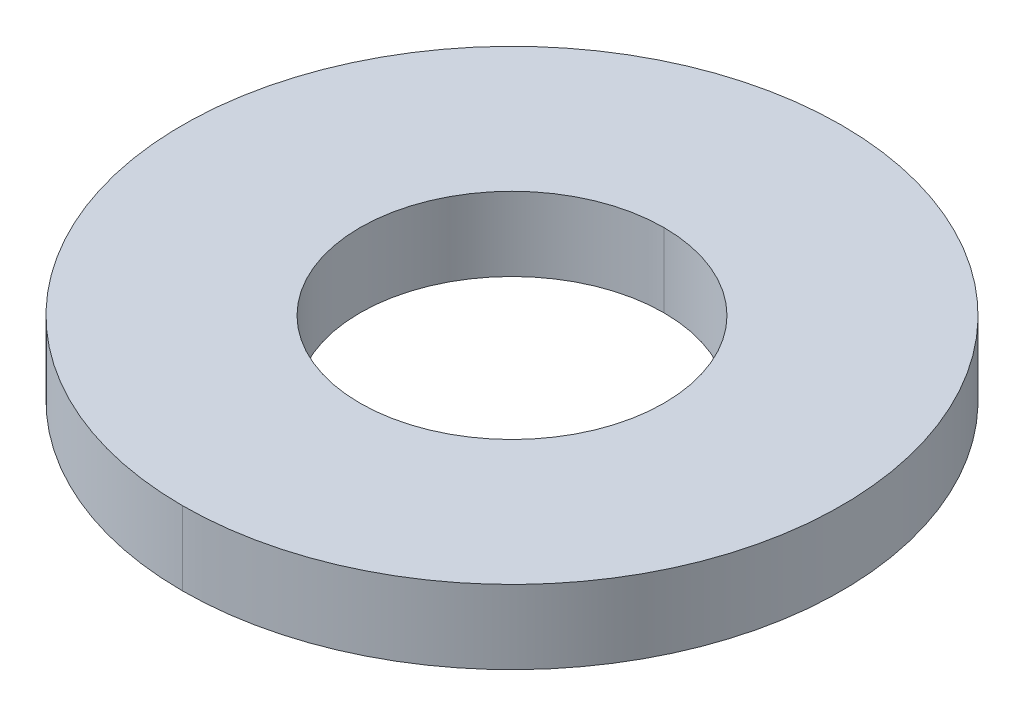
ISO-10303-21;
HEADER;
FILE_DESCRIPTION(('STEP AP214'),'2;1');
FILE_NAME('part.step','',(''),(''),'','','');
FILE_SCHEMA(('AUTOMOTIVE_DESIGN { 1 0 10303 214 1 1 1 1 }'));
ENDSEC;
DATA;
#1=APPLICATION_CONTEXT('core data for automotive mechanical design processes');
#2=APPLICATION_PROTOCOL_DEFINITION('international standard','automotive_design',2000,#1);
#3=PRODUCT_CONTEXT('',#1,'mechanical');
#4=PRODUCT('Part','Part','',(#3));
#5=PRODUCT_RELATED_PRODUCT_CATEGORY('part','',(#4));
#6=PRODUCT_DEFINITION_FORMATION('','',#4);
#7=PRODUCT_DEFINITION_CONTEXT('part definition',#1,'design');
#8=PRODUCT_DEFINITION('design','',#6,#7);
#9=PRODUCT_DEFINITION_SHAPE('','',#8);
#10=(LENGTH_UNIT() NAMED_UNIT(*) SI_UNIT(.MILLI.,.METRE.));
#11=(NAMED_UNIT(*) PLANE_ANGLE_UNIT() SI_UNIT($,.RADIAN.));
#12=(NAMED_UNIT(*) SI_UNIT($,.STERADIAN.) SOLID_ANGLE_UNIT());
#13=UNCERTAINTY_MEASURE_WITH_UNIT(LENGTH_MEASURE(1.E-05),#10,'distance_accuracy_value','');
#14=(GEOMETRIC_REPRESENTATION_CONTEXT(3) GLOBAL_UNCERTAINTY_ASSIGNED_CONTEXT((#13)) GLOBAL_UNIT_ASSIGNED_CONTEXT((#10,
#11,#12)) REPRESENTATION_CONTEXT('',''));
#15=CARTESIAN_POINT('',(0.,0.,0.));
#16=DIRECTION('',(0.,0.,1.));
#17=DIRECTION('',(1.,0.,0.));
#18=AXIS2_PLACEMENT_3D('',#15,#16,#17);
#19=CARTESIAN_POINT('',(0.,1.0668,0.));
#20=DIRECTION('',(0.,-1.,0.));
#21=DIRECTION('',(0.,0.,-1.));
#22=AXIS2_PLACEMENT_3D('',#19,#20,#21);
#23=CYLINDRICAL_SURFACE('',#22,2.1971);
#24=CARTESIAN_POINT('',(0.,1.0668,0.));
#25=DIRECTION('',(0.,1.,0.));
#26=DIRECTION('',(0.,0.,1.));
#27=AXIS2_PLACEMENT_3D('',#24,#25,#26);
#28=CIRCLE('',#27,2.1971);
#29=CARTESIAN_POINT('',(0.,1.0668,-2.1971));
#30=VERTEX_POINT('',#29);
#31=CARTESIAN_POINT('',(0.,1.0668,2.1971));
#32=VERTEX_POINT('',#31);
#33=EDGE_CURVE('E102',#30,#32,#28,.T.);
#34=ORIENTED_EDGE('',*,*,#33,.T.);
#35=DIRECTION('',(0.,-1.,0.));
#36=VECTOR('',#35,1.);
#37=CARTESIAN_POINT('',(0.,1.0668,2.1971));
#38=LINE('',#37,#36);
#39=CARTESIAN_POINT('',(0.,0.,2.1971));
#40=VERTEX_POINT('',#39);
#41=EDGE_CURVE('E18',#32,#40,#38,.T.);
#42=ORIENTED_EDGE('',*,*,#41,.T.);
#43=CARTESIAN_POINT('',(0.,0.,0.));
#44=DIRECTION('',(0.,1.,0.));
#45=DIRECTION('',(0.,0.,1.));
#46=AXIS2_PLACEMENT_3D('',#43,#44,#45);
#47=CIRCLE('',#46,2.1971);
#48=CARTESIAN_POINT('',(0.,0.,-2.1971));
#49=VERTEX_POINT('',#48);
#50=EDGE_CURVE('E109',#49,#40,#47,.T.);
#51=ORIENTED_EDGE('',*,*,#50,.F.);
#52=DIRECTION('',(0.,-1.,0.));
#53=VECTOR('',#52,1.);
#54=CARTESIAN_POINT('',(0.,1.0668,-2.1971));
#55=LINE('',#54,#53);
#56=EDGE_CURVE('E9',#30,#49,#55,.T.);
#57=ORIENTED_EDGE('',*,*,#56,.F.);
#58=EDGE_LOOP('',(#34,#42,#51,#57));
#59=FACE_BOUND('',#58,.T.);
#60=ADVANCED_FACE('F15',(#59),#23,.F.);
#61=CARTESIAN_POINT('',(0.,1.0668,0.));
#62=DIRECTION('',(0.,-1.,0.));
#63=DIRECTION('',(0.,0.,-1.));
#64=AXIS2_PLACEMENT_3D('',#61,#62,#63);
#65=CYLINDRICAL_SURFACE('',#64,2.1971);
#66=ORIENTED_EDGE('',*,*,#41,.F.);
#67=CARTESIAN_POINT('',(0.,1.0668,0.));
#68=DIRECTION('',(0.,1.,0.));
#69=DIRECTION('',(0.,0.,1.));
#70=AXIS2_PLACEMENT_3D('',#67,#68,#69);
#71=CIRCLE('',#70,2.1971);
#72=EDGE_CURVE('E110',#32,#30,#71,.T.);
#73=ORIENTED_EDGE('',*,*,#72,.T.);
#74=ORIENTED_EDGE('',*,*,#56,.T.);
#75=CARTESIAN_POINT('',(0.,0.,0.));
#76=DIRECTION('',(0.,1.,0.));
#77=DIRECTION('',(0.,0.,1.));
#78=AXIS2_PLACEMENT_3D('',#75,#76,#77);
#79=CIRCLE('',#78,2.1971);
#80=EDGE_CURVE('E114',#40,#49,#79,.T.);
#81=ORIENTED_EDGE('',*,*,#80,.F.);
#82=EDGE_LOOP('',(#66,#73,#74,#81));
#83=FACE_BOUND('',#82,.T.);
#84=ADVANCED_FACE('F150',(#83),#65,.F.);
#85=CARTESIAN_POINT('',(0.,0.,0.));
#86=DIRECTION('',(0.,1.,0.));
#87=DIRECTION('',(1.,0.,0.));
#88=AXIS2_PLACEMENT_3D('',#85,#86,#87);
#89=PLANE('',#88);
#90=ORIENTED_EDGE('',*,*,#50,.T.);
#91=ORIENTED_EDGE('',*,*,#80,.T.);
#92=EDGE_LOOP('',(#90,#91));
#93=FACE_BOUND('',#92,.T.);
#94=CARTESIAN_POINT('',(0.,0.,0.));
#95=DIRECTION('',(0.,1.,0.));
#96=DIRECTION('',(0.,0.,1.));
#97=AXIS2_PLACEMENT_3D('',#94,#95,#96);
#98=CIRCLE('',#97,4.7625);
#99=CARTESIAN_POINT('',(0.,0.,-4.7625));
#100=VERTEX_POINT('',#99);
#101=CARTESIAN_POINT('',(0.,0.,4.7625));
#102=VERTEX_POINT('',#101);
#103=EDGE_CURVE('E79',#100,#102,#98,.T.);
#104=ORIENTED_EDGE('',*,*,#103,.F.);
#105=CARTESIAN_POINT('',(0.,0.,0.));
#106=DIRECTION('',(0.,1.,0.));
#107=DIRECTION('',(0.,0.,1.));
#108=AXIS2_PLACEMENT_3D('',#105,#106,#107);
#109=CIRCLE('',#108,4.7625);
#110=EDGE_CURVE('E89',#102,#100,#109,.T.);
#111=ORIENTED_EDGE('',*,*,#110,.F.);
#112=EDGE_LOOP('',(#104,#111));
#113=FACE_BOUND('',#112,.T.);
#114=ADVANCED_FACE('F155',(#93,#113),#89,.F.);
#115=CARTESIAN_POINT('',(0.,1.0668,0.));
#116=DIRECTION('',(0.,1.,0.));
#117=DIRECTION('',(1.,0.,0.));
#118=AXIS2_PLACEMENT_3D('',#115,#116,#117);
#119=PLANE('',#118);
#120=ORIENTED_EDGE('',*,*,#33,.F.);
#121=ORIENTED_EDGE('',*,*,#72,.F.);
#122=EDGE_LOOP('',(#120,#121));
#123=FACE_BOUND('',#122,.T.);
#124=CARTESIAN_POINT('',(0.,1.0668,0.));
#125=DIRECTION('',(0.,1.,0.));
#126=DIRECTION('',(0.,0.,1.));
#127=AXIS2_PLACEMENT_3D('',#124,#125,#126);
#128=CIRCLE('',#127,4.7625);
#129=CARTESIAN_POINT('',(0.,1.0668,-4.7625));
#130=VERTEX_POINT('',#129);
#131=CARTESIAN_POINT('',(0.,1.0668,4.7625));
#132=VERTEX_POINT('',#131);
#133=EDGE_CURVE('E75',#130,#132,#128,.T.);
#134=ORIENTED_EDGE('',*,*,#133,.T.);
#135=CARTESIAN_POINT('',(0.,1.0668,0.));
#136=DIRECTION('',(0.,1.,0.));
#137=DIRECTION('',(0.,0.,1.));
#138=AXIS2_PLACEMENT_3D('',#135,#136,#137);
#139=CIRCLE('',#138,4.7625);
#140=EDGE_CURVE('E74',#132,#130,#139,.T.);
#141=ORIENTED_EDGE('',*,*,#140,.T.);
#142=EDGE_LOOP('',(#134,#141));
#143=FACE_BOUND('',#142,.T.);
#144=ADVANCED_FACE('F73',(#123,#143),#119,.T.);
#145=CARTESIAN_POINT('',(0.,1.0668,0.));
#146=DIRECTION('',(0.,-1.,0.));
#147=DIRECTION('',(0.,0.,-1.));
#148=AXIS2_PLACEMENT_3D('',#145,#146,#147);
#149=CYLINDRICAL_SURFACE('',#148,4.7625);
#150=DIRECTION('',(0.,-1.,0.));
#151=VECTOR('',#150,1.);
#152=CARTESIAN_POINT('',(0.,1.0668,4.7625));
#153=LINE('',#152,#151);
#154=EDGE_CURVE('E82',#132,#102,#153,.T.);
#155=ORIENTED_EDGE('',*,*,#154,.F.);
#156=ORIENTED_EDGE('',*,*,#133,.F.);
#157=DIRECTION('',(0.,-1.,0.));
#158=VECTOR('',#157,1.);
#159=CARTESIAN_POINT('',(0.,1.0668,-4.7625));
#160=LINE('',#159,#158);
#161=EDGE_CURVE('E81',#130,#100,#160,.T.);
#162=ORIENTED_EDGE('',*,*,#161,.T.);
#163=ORIENTED_EDGE('',*,*,#103,.T.);
#164=EDGE_LOOP('',(#155,#156,#162,#163));
#165=FACE_BOUND('',#164,.T.);
#166=ADVANCED_FACE('F84',(#165),#149,.T.);
#167=CARTESIAN_POINT('',(0.,1.0668,0.));
#168=DIRECTION('',(0.,-1.,0.));
#169=DIRECTION('',(0.,0.,-1.));
#170=AXIS2_PLACEMENT_3D('',#167,#168,#169);
#171=CYLINDRICAL_SURFACE('',#170,4.7625);
#172=ORIENTED_EDGE('',*,*,#140,.F.);
#173=ORIENTED_EDGE('',*,*,#154,.T.);
#174=ORIENTED_EDGE('',*,*,#110,.T.);
#175=ORIENTED_EDGE('',*,*,#161,.F.);
#176=EDGE_LOOP('',(#172,#173,#174,#175));
#177=FACE_BOUND('',#176,.T.);
#178=ADVANCED_FACE('F95',(#177),#171,.T.);
#179=CLOSED_SHELL('',(#60,#84,#114,#144,#166,#178));
#180=MANIFOLD_SOLID_BREP('B1',#179);
#181=ADVANCED_BREP_SHAPE_REPRESENTATION('',(#18,#180),#14);
#182=SHAPE_DEFINITION_REPRESENTATION(#9,#181);
ENDSEC;
END-ISO-10303-21;
